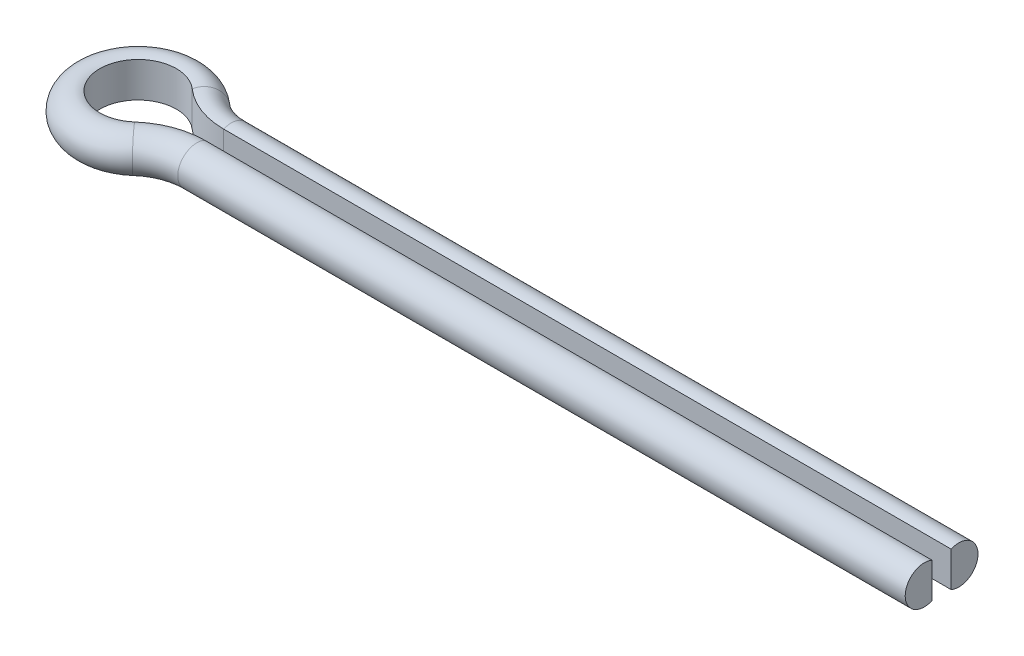
ISO-10303-21;
HEADER;
FILE_DESCRIPTION(('STEP AP214'),'2;1');
FILE_NAME('part.step','',(''),(''),'','','');
FILE_SCHEMA(('AUTOMOTIVE_DESIGN { 1 0 10303 214 1 1 1 1 }'));
ENDSEC;
DATA;
#1=APPLICATION_CONTEXT('core data for automotive mechanical design processes');
#2=APPLICATION_PROTOCOL_DEFINITION('international standard','automotive_design',2000,#1);
#3=PRODUCT_CONTEXT('',#1,'mechanical');
#4=PRODUCT('Part','Part','',(#3));
#5=PRODUCT_RELATED_PRODUCT_CATEGORY('part','',(#4));
#6=PRODUCT_DEFINITION_FORMATION('','',#4);
#7=PRODUCT_DEFINITION_CONTEXT('part definition',#1,'design');
#8=PRODUCT_DEFINITION('design','',#6,#7);
#9=PRODUCT_DEFINITION_SHAPE('','',#8);
#10=(LENGTH_UNIT() NAMED_UNIT(*) SI_UNIT(.MILLI.,.METRE.));
#11=(NAMED_UNIT(*) PLANE_ANGLE_UNIT() SI_UNIT($,.RADIAN.));
#12=(NAMED_UNIT(*) SI_UNIT($,.STERADIAN.) SOLID_ANGLE_UNIT());
#13=UNCERTAINTY_MEASURE_WITH_UNIT(LENGTH_MEASURE(1.E-05),#10,'distance_accuracy_value','');
#14=(GEOMETRIC_REPRESENTATION_CONTEXT(3) GLOBAL_UNCERTAINTY_ASSIGNED_CONTEXT((#13)) GLOBAL_UNIT_ASSIGNED_CONTEXT((#10,
#11,#12)) REPRESENTATION_CONTEXT('',''));
#15=CARTESIAN_POINT('',(0.,0.,0.));
#16=DIRECTION('',(0.,0.,1.));
#17=DIRECTION('',(1.,0.,0.));
#18=AXIS2_PLACEMENT_3D('',#15,#16,#17);
#19=CARTESIAN_POINT('',(104.841229182759,0.,2.25000000000001));
#20=DIRECTION('',(-1.,0.,0.));
#21=DIRECTION('',(0.,0.,1.));
#22=AXIS2_PLACEMENT_3D('',#19,#20,#21);
#23=PLANE('',#22);
#24=CARTESIAN_POINT('',(104.841229182759,0.,2.25000000000001));
#25=DIRECTION('',(-1.,0.,0.));
#26=DIRECTION('',(0.,0.,1.));
#27=AXIS2_PLACEMENT_3D('',#24,#25,#26);
#28=CIRCLE('',#27,2.5);
#29=CARTESIAN_POINT('',(104.841229182759,-2.29128784747792,1.25000000000001));
#30=VERTEX_POINT('',#29);
#31=CARTESIAN_POINT('',(104.841229182759,2.29128784747792,1.25));
#32=VERTEX_POINT('',#31);
#33=EDGE_CURVE('E79',#30,#32,#28,.T.);
#34=ORIENTED_EDGE('',*,*,#33,.F.);
#35=DIRECTION('',(0.,-1.,0.));
#36=VECTOR('',#35,1.);
#37=CARTESIAN_POINT('',(104.841229182759,2.29128784747792,1.25));
#38=LINE('',#37,#36);
#39=EDGE_CURVE('E81',#32,#30,#38,.T.);
#40=ORIENTED_EDGE('',*,*,#39,.F.);
#41=EDGE_LOOP('',(#34,#40));
#42=FACE_BOUND('',#41,.T.);
#43=ADVANCED_FACE('F33',(#42),#23,.F.);
#44=CARTESIAN_POINT('',(104.841229182759,0.,-2.25000000000001));
#45=DIRECTION('',(1.,0.,0.));
#46=DIRECTION('',(0.,0.,-1.));
#47=AXIS2_PLACEMENT_3D('',#44,#45,#46);
#48=PLANE('',#47);
#49=CARTESIAN_POINT('',(104.841229182759,0.,-2.25000000000001));
#50=DIRECTION('',(1.,0.,0.));
#51=DIRECTION('',(0.,0.,-1.));
#52=AXIS2_PLACEMENT_3D('',#49,#50,#51);
#53=CIRCLE('',#52,2.5);
#54=CARTESIAN_POINT('',(104.841229182759,-2.29128784747792,-1.25000000000001));
#55=VERTEX_POINT('',#54);
#56=CARTESIAN_POINT('',(104.841229182759,2.29128784747792,-1.25));
#57=VERTEX_POINT('',#56);
#58=EDGE_CURVE('E45',#55,#57,#53,.T.);
#59=ORIENTED_EDGE('',*,*,#58,.T.);
#60=DIRECTION('',(0.,-1.,0.));
#61=VECTOR('',#60,1.);
#62=CARTESIAN_POINT('',(104.841229182759,2.29128784747792,-1.25));
#63=LINE('',#62,#61);
#64=EDGE_CURVE('E11',#57,#55,#63,.T.);
#65=ORIENTED_EDGE('',*,*,#64,.T.);
#66=EDGE_LOOP('',(#59,#65));
#67=FACE_BOUND('',#66,.T.);
#68=ADVANCED_FACE('F184',(#67),#48,.T.);
#69=CARTESIAN_POINT('',(104.841229182759,0.,2.25000000000001));
#70=DIRECTION('',(-1.,0.,0.));
#71=DIRECTION('',(0.,0.,1.));
#72=AXIS2_PLACEMENT_3D('',#69,#70,#71);
#73=CYLINDRICAL_SURFACE('',#72,2.5);
#74=DIRECTION('',(-1.,0.,0.));
#75=VECTOR('',#74,1.);
#76=CARTESIAN_POINT('',(104.841229182759,2.29128784747792,1.25));
#77=LINE('',#76,#75);
#78=CARTESIAN_POINT('',(9.92156741649226,2.29128784747792,1.24999999999999));
#79=VERTEX_POINT('',#78);
#80=EDGE_CURVE('E92',#32,#79,#77,.T.);
#81=ORIENTED_EDGE('',*,*,#80,.T.);
#82=CARTESIAN_POINT('',(9.92156741649226,0.,2.24999999999999));
#83=DIRECTION('',(-1.,0.,0.));
#84=DIRECTION('',(0.,0.,1.));
#85=AXIS2_PLACEMENT_3D('',#82,#83,#84);
#86=CIRCLE('',#85,2.5);
#87=CARTESIAN_POINT('',(9.92156741649226,-2.29128784747792,1.24999999999999));
#88=VERTEX_POINT('',#87);
#89=EDGE_CURVE('E97',#88,#79,#86,.T.);
#90=ORIENTED_EDGE('',*,*,#89,.F.);
#91=DIRECTION('',(-1.,0.,0.));
#92=VECTOR('',#91,1.);
#93=CARTESIAN_POINT('',(104.841229182759,-2.29128784747792,1.25000000000001));
#94=LINE('',#93,#92);
#95=EDGE_CURVE('E91',#30,#88,#94,.T.);
#96=ORIENTED_EDGE('',*,*,#95,.F.);
#97=ORIENTED_EDGE('',*,*,#33,.T.);
#98=EDGE_LOOP('',(#81,#90,#96,#97));
#99=FACE_BOUND('',#98,.T.);
#100=ADVANCED_FACE('F95',(#99),#73,.T.);
#101=CARTESIAN_POINT('',(104.841229182759,2.29128784747792,1.25));
#102=DIRECTION('',(0.,0.,-1.));
#103=DIRECTION('',(0.,1.,0.));
#104=AXIS2_PLACEMENT_3D('',#101,#102,#103);
#105=PLANE('',#104);
#106=DIRECTION('',(0.,-1.,0.));
#107=VECTOR('',#106,1.);
#108=CARTESIAN_POINT('',(9.92156741649226,2.29128784747792,1.24999999999999));
#109=LINE('',#108,#107);
#110=EDGE_CURVE('E112',#79,#88,#109,.T.);
#111=ORIENTED_EDGE('',*,*,#110,.F.);
#112=ORIENTED_EDGE('',*,*,#80,.F.);
#113=ORIENTED_EDGE('',*,*,#39,.T.);
#114=ORIENTED_EDGE('',*,*,#95,.T.);
#115=EDGE_LOOP('',(#111,#112,#113,#114));
#116=FACE_BOUND('',#115,.T.);
#117=ADVANCED_FACE('F90',(#116),#105,.T.);
#118=CARTESIAN_POINT('',(9.9215674164922,0.,11.25));
#119=DIRECTION('',(0.,1.,0.));
#120=DIRECTION('',(0.,0.,1.));
#121=AXIS2_PLACEMENT_3D('',#118,#119,#120);
#122=TOROIDAL_SURFACE('',#121,9.00000000000001,2.5);
#123=CARTESIAN_POINT('',(9.9215674164922,2.29128784747792,11.25));
#124=DIRECTION('',(0.,1.,0.));
#125=DIRECTION('',(0.,0.,-1.));
#126=AXIS2_PLACEMENT_3D('',#123,#124,#125);
#127=CIRCLE('',#126,10.);
#128=CARTESIAN_POINT('',(3.30718913883077,2.29128784747792,3.74999999999995));
#129=VERTEX_POINT('',#128);
#130=EDGE_CURVE('E105',#79,#129,#127,.T.);
#131=ORIENTED_EDGE('',*,*,#130,.T.);
#132=CARTESIAN_POINT('',(3.96862696659692,0.,4.49999999999995));
#133=DIRECTION('',(-0.750000000000001,0.,0.661437827766147));
#134=DIRECTION('',(0.661437827766147,0.,0.750000000000001));
#135=AXIS2_PLACEMENT_3D('',#132,#133,#134);
#136=CIRCLE('',#135,2.5);
#137=CARTESIAN_POINT('',(3.30718913883077,-2.29128784747792,3.74999999999995));
#138=VERTEX_POINT('',#137);
#139=EDGE_CURVE('E102',#138,#129,#136,.T.);
#140=ORIENTED_EDGE('',*,*,#139,.F.);
#141=CARTESIAN_POINT('',(9.9215674164922,-2.29128784747792,11.25));
#142=DIRECTION('',(0.,1.,0.));
#143=DIRECTION('',(0.,0.,-1.));
#144=AXIS2_PLACEMENT_3D('',#141,#142,#143);
#145=CIRCLE('',#144,10.);
#146=EDGE_CURVE('E106',#88,#138,#145,.T.);
#147=ORIENTED_EDGE('',*,*,#146,.F.);
#148=ORIENTED_EDGE('',*,*,#89,.T.);
#149=EDGE_LOOP('',(#131,#140,#147,#148));
#150=FACE_BOUND('',#149,.T.);
#151=ADVANCED_FACE('F164',(#150),#122,.T.);
#152=CARTESIAN_POINT('',(9.9215674164922,0.,11.25));
#153=DIRECTION('',(0.,1.,0.));
#154=DIRECTION('',(0.,0.,1.));
#155=AXIS2_PLACEMENT_3D('',#152,#153,#154);
#156=CYLINDRICAL_SURFACE('',#155,10.);
#157=DIRECTION('',(0.,-1.,0.));
#158=VECTOR('',#157,1.);
#159=CARTESIAN_POINT('',(3.30718913883077,2.29128784747792,3.74999999999995));
#160=LINE('',#159,#158);
#161=EDGE_CURVE('E109',#129,#138,#160,.T.);
#162=ORIENTED_EDGE('',*,*,#161,.F.);
#163=ORIENTED_EDGE('',*,*,#130,.F.);
#164=ORIENTED_EDGE('',*,*,#110,.T.);
#165=ORIENTED_EDGE('',*,*,#146,.T.);
#166=EDGE_LOOP('',(#162,#163,#164,#165));
#167=FACE_BOUND('',#166,.T.);
#168=ADVANCED_FACE('F165',(#167),#156,.T.);
#169=CARTESIAN_POINT('',(0.,0.,0.));
#170=DIRECTION('',(0.,-1.,0.));
#171=DIRECTION('',(0.,0.,-1.));
#172=AXIS2_PLACEMENT_3D('',#169,#170,#171);
#173=TOROIDAL_SURFACE('',#172,6.,2.5);
#174=CARTESIAN_POINT('',(0.,2.29128784747792,0.));
#175=DIRECTION('',(0.,-1.,0.));
#176=DIRECTION('',(0.661437827766153,0.,0.749999999999995));
#177=AXIS2_PLACEMENT_3D('',#174,#175,#176);
#178=CIRCLE('',#177,5.);
#179=CARTESIAN_POINT('',(3.30718913883069,2.29128784747792,-3.75000000000004));
#180=VERTEX_POINT('',#179);
#181=EDGE_CURVE('E116',#129,#180,#178,.T.);
#182=ORIENTED_EDGE('',*,*,#181,.T.);
#183=CARTESIAN_POINT('',(3.96862696659685,0.,-4.50000000000005));
#184=DIRECTION('',(0.75,0.,0.661437827766147));
#185=DIRECTION('',(0.661437827766147,0.,-0.750000000000001));
#186=AXIS2_PLACEMENT_3D('',#183,#184,#185);
#187=CIRCLE('',#186,2.5);
#188=CARTESIAN_POINT('',(3.30718913883069,-2.29128784747792,-3.75000000000004));
#189=VERTEX_POINT('',#188);
#190=EDGE_CURVE('E113',#189,#180,#187,.T.);
#191=ORIENTED_EDGE('',*,*,#190,.F.);
#192=CARTESIAN_POINT('',(0.,-2.29128784747792,0.));
#193=DIRECTION('',(0.,-1.,0.));
#194=DIRECTION('',(0.661437827766153,0.,0.749999999999995));
#195=AXIS2_PLACEMENT_3D('',#192,#193,#194);
#196=CIRCLE('',#195,5.);
#197=EDGE_CURVE('E117',#138,#189,#196,.T.);
#198=ORIENTED_EDGE('',*,*,#197,.F.);
#199=ORIENTED_EDGE('',*,*,#139,.T.);
#200=EDGE_LOOP('',(#182,#191,#198,#199));
#201=FACE_BOUND('',#200,.T.);
#202=ADVANCED_FACE('F158',(#201),#173,.T.);
#203=CARTESIAN_POINT('',(0.,0.,0.));
#204=DIRECTION('',(0.,-1.,0.));
#205=DIRECTION('',(0.,0.,-1.));
#206=AXIS2_PLACEMENT_3D('',#203,#204,#205);
#207=CYLINDRICAL_SURFACE('',#206,5.);
#208=DIRECTION('',(0.,-1.,0.));
#209=VECTOR('',#208,1.);
#210=CARTESIAN_POINT('',(3.3071891388307,2.29128784747792,-3.75000000000004));
#211=LINE('',#210,#209);
#212=EDGE_CURVE('E120',#180,#189,#211,.T.);
#213=ORIENTED_EDGE('',*,*,#212,.F.);
#214=ORIENTED_EDGE('',*,*,#181,.F.);
#215=ORIENTED_EDGE('',*,*,#161,.T.);
#216=ORIENTED_EDGE('',*,*,#197,.T.);
#217=EDGE_LOOP('',(#213,#214,#215,#216));
#218=FACE_BOUND('',#217,.T.);
#219=ADVANCED_FACE('F159',(#218),#207,.F.);
#220=CARTESIAN_POINT('',(9.9215674164922,0.,-11.25));
#221=DIRECTION('',(0.,1.,0.));
#222=DIRECTION('',(0.,0.,1.));
#223=AXIS2_PLACEMENT_3D('',#220,#221,#222);
#224=TOROIDAL_SURFACE('',#223,9.00000000000002,2.5);
#225=CARTESIAN_POINT('',(9.9215674164922,2.29128784747792,-11.25));
#226=DIRECTION('',(0.,1.,0.));
#227=DIRECTION('',(-0.661437827766149,0.,0.749999999999999));
#228=AXIS2_PLACEMENT_3D('',#225,#226,#227);
#229=CIRCLE('',#228,10.);
#230=CARTESIAN_POINT('',(9.92156741649214,2.29128784747792,-1.25));
#231=VERTEX_POINT('',#230);
#232=EDGE_CURVE('E126',#180,#231,#229,.T.);
#233=ORIENTED_EDGE('',*,*,#232,.T.);
#234=CARTESIAN_POINT('',(9.92156741649214,0.,-2.25));
#235=DIRECTION('',(1.,0.,0.));
#236=DIRECTION('',(0.,0.,-1.));
#237=AXIS2_PLACEMENT_3D('',#234,#235,#236);
#238=CIRCLE('',#237,2.5);
#239=CARTESIAN_POINT('',(9.92156741649214,-2.29128784747792,-1.25));
#240=VERTEX_POINT('',#239);
#241=EDGE_CURVE('E123',#240,#231,#238,.T.);
#242=ORIENTED_EDGE('',*,*,#241,.F.);
#243=CARTESIAN_POINT('',(9.9215674164922,-2.29128784747792,-11.25));
#244=DIRECTION('',(0.,1.,0.));
#245=DIRECTION('',(-0.661437827766149,0.,0.749999999999999));
#246=AXIS2_PLACEMENT_3D('',#243,#244,#245);
#247=CIRCLE('',#246,10.);
#248=EDGE_CURVE('E127',#189,#240,#247,.T.);
#249=ORIENTED_EDGE('',*,*,#248,.F.);
#250=ORIENTED_EDGE('',*,*,#190,.T.);
#251=EDGE_LOOP('',(#233,#242,#249,#250));
#252=FACE_BOUND('',#251,.T.);
#253=ADVANCED_FACE('F151',(#252),#224,.T.);
#254=CARTESIAN_POINT('',(9.9215674164922,0.,-11.25));
#255=DIRECTION('',(0.,1.,0.));
#256=DIRECTION('',(0.,0.,1.));
#257=AXIS2_PLACEMENT_3D('',#254,#255,#256);
#258=CYLINDRICAL_SURFACE('',#257,10.);
#259=DIRECTION('',(0.,-1.,0.));
#260=VECTOR('',#259,1.);
#261=CARTESIAN_POINT('',(9.92156741649214,2.29128784747792,-1.25));
#262=LINE('',#261,#260);
#263=EDGE_CURVE('E130',#231,#240,#262,.T.);
#264=ORIENTED_EDGE('',*,*,#263,.F.);
#265=ORIENTED_EDGE('',*,*,#232,.F.);
#266=ORIENTED_EDGE('',*,*,#212,.T.);
#267=ORIENTED_EDGE('',*,*,#248,.T.);
#268=EDGE_LOOP('',(#264,#265,#266,#267));
#269=FACE_BOUND('',#268,.T.);
#270=ADVANCED_FACE('F153',(#269),#258,.T.);
#271=CARTESIAN_POINT('',(9.92156741649215,0.,-2.24999999999999));
#272=DIRECTION('',(1.,0.,0.));
#273=DIRECTION('',(0.,0.,-1.));
#274=AXIS2_PLACEMENT_3D('',#271,#272,#273);
#275=CYLINDRICAL_SURFACE('',#274,2.5);
#276=DIRECTION('',(1.,0.,0.));
#277=VECTOR('',#276,1.);
#278=CARTESIAN_POINT('',(9.92156741649215,2.29128784747792,-1.24999999999999));
#279=LINE('',#278,#277);
#280=EDGE_CURVE('E40',#231,#57,#279,.T.);
#281=ORIENTED_EDGE('',*,*,#280,.T.);
#282=ORIENTED_EDGE('',*,*,#58,.F.);
#283=DIRECTION('',(1.,0.,0.));
#284=VECTOR('',#283,1.);
#285=CARTESIAN_POINT('',(9.92156741649215,-2.29128784747792,-1.24999999999999));
#286=LINE('',#285,#284);
#287=EDGE_CURVE('E134',#240,#55,#286,.T.);
#288=ORIENTED_EDGE('',*,*,#287,.F.);
#289=ORIENTED_EDGE('',*,*,#241,.T.);
#290=EDGE_LOOP('',(#281,#282,#288,#289));
#291=FACE_BOUND('',#290,.T.);
#292=ADVANCED_FACE('F177',(#291),#275,.T.);
#293=CARTESIAN_POINT('',(9.92156741649215,2.29128784747792,-1.24999999999999));
#294=DIRECTION('',(0.,0.,1.));
#295=DIRECTION('',(0.,-1.,0.));
#296=AXIS2_PLACEMENT_3D('',#293,#294,#295);
#297=PLANE('',#296);
#298=ORIENTED_EDGE('',*,*,#64,.F.);
#299=ORIENTED_EDGE('',*,*,#280,.F.);
#300=ORIENTED_EDGE('',*,*,#263,.T.);
#301=ORIENTED_EDGE('',*,*,#287,.T.);
#302=EDGE_LOOP('',(#298,#299,#300,#301));
#303=FACE_BOUND('',#302,.T.);
#304=ADVANCED_FACE('F148',(#303),#297,.T.);
#305=CLOSED_SHELL('',(#43,#68,#100,#117,#151,#168,#202,#219,#253,#270,#292,#304));
#306=MANIFOLD_SOLID_BREP('B2',#305);
#307=ADVANCED_BREP_SHAPE_REPRESENTATION('',(#18,#306),#14);
#308=SHAPE_DEFINITION_REPRESENTATION(#9,#307);
ENDSEC;
END-ISO-10303-21;
